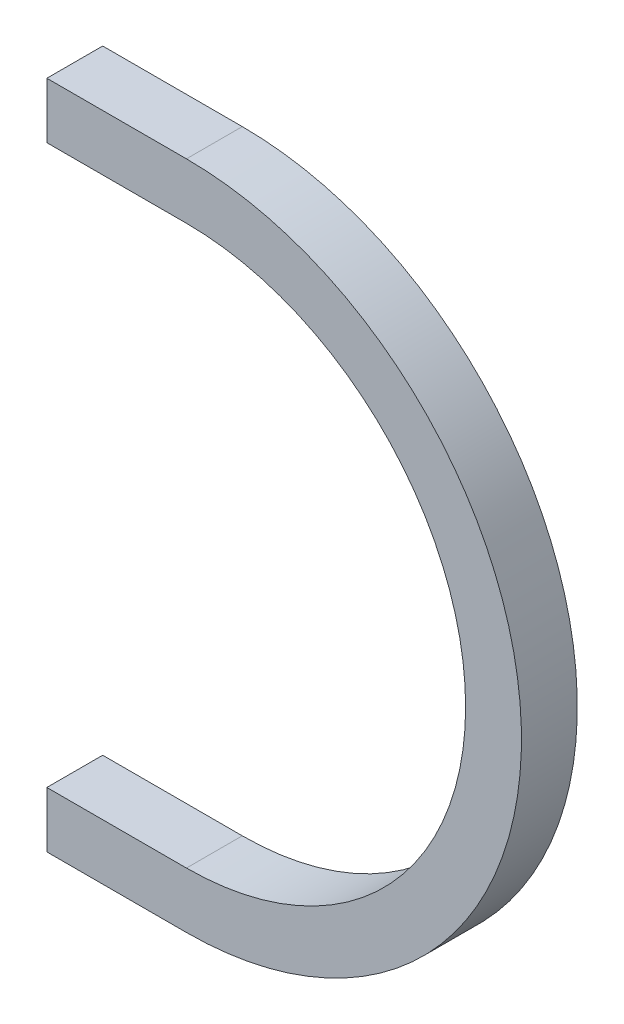
ISO-10303-21;
HEADER;
FILE_DESCRIPTION(('STEP AP214'),'2;1');
FILE_NAME('part.step','',(''),(''),'','','');
FILE_SCHEMA(('AUTOMOTIVE_DESIGN { 1 0 10303 214 1 1 1 1 }'));
ENDSEC;
DATA;
#1=APPLICATION_CONTEXT('core data for automotive mechanical design processes');
#2=APPLICATION_PROTOCOL_DEFINITION('international standard','automotive_design',2000,#1);
#3=PRODUCT_CONTEXT('',#1,'mechanical');
#4=PRODUCT('Part','Part','',(#3));
#5=PRODUCT_RELATED_PRODUCT_CATEGORY('part','',(#4));
#6=PRODUCT_DEFINITION_FORMATION('','',#4);
#7=PRODUCT_DEFINITION_CONTEXT('part definition',#1,'design');
#8=PRODUCT_DEFINITION('design','',#6,#7);
#9=PRODUCT_DEFINITION_SHAPE('','',#8);
#10=(LENGTH_UNIT() NAMED_UNIT(*) SI_UNIT(.MILLI.,.METRE.));
#11=(NAMED_UNIT(*) PLANE_ANGLE_UNIT() SI_UNIT($,.RADIAN.));
#12=(NAMED_UNIT(*) SI_UNIT($,.STERADIAN.) SOLID_ANGLE_UNIT());
#13=UNCERTAINTY_MEASURE_WITH_UNIT(LENGTH_MEASURE(1.E-05),#10,'distance_accuracy_value','');
#14=(GEOMETRIC_REPRESENTATION_CONTEXT(3) GLOBAL_UNCERTAINTY_ASSIGNED_CONTEXT((#13)) GLOBAL_UNIT_ASSIGNED_CONTEXT((#10,
#11,#12)) REPRESENTATION_CONTEXT('',''));
#15=CARTESIAN_POINT('',(0.,0.,0.));
#16=DIRECTION('',(0.,0.,1.));
#17=DIRECTION('',(1.,0.,0.));
#18=AXIS2_PLACEMENT_3D('',#15,#16,#17);
#19=CARTESIAN_POINT('',(0.,0.,200.));
#20=DIRECTION('',(0.,-1.,0.));
#21=DIRECTION('',(0.,0.,-1.));
#22=AXIS2_PLACEMENT_3D('',#19,#20,#21);
#23=PLANE('',#22);
#24=DIRECTION('',(-1.,0.,0.));
#25=VECTOR('',#24,1.);
#26=CARTESIAN_POINT('',(0.,0.,0.));
#27=LINE('',#26,#25);
#28=CARTESIAN_POINT('',(500.,0.,0.));
#29=VERTEX_POINT('',#28);
#30=CARTESIAN_POINT('',(0.,0.,0.));
#31=VERTEX_POINT('',#30);
#32=EDGE_CURVE('E140',#29,#31,#27,.T.);
#33=ORIENTED_EDGE('',*,*,#32,.T.);
#34=DIRECTION('',(0.,0.,-1.));
#35=VECTOR('',#34,1.);
#36=CARTESIAN_POINT('',(0.,0.,200.));
#37=LINE('',#36,#35);
#38=CARTESIAN_POINT('',(0.,0.,200.));
#39=VERTEX_POINT('',#38);
#40=EDGE_CURVE('E11',#39,#31,#37,.T.);
#41=ORIENTED_EDGE('',*,*,#40,.F.);
#42=DIRECTION('',(-1.,0.,0.));
#43=VECTOR('',#42,1.);
#44=CARTESIAN_POINT('',(0.,0.,200.));
#45=LINE('',#44,#43);
#46=CARTESIAN_POINT('',(500.,0.,200.));
#47=VERTEX_POINT('',#46);
#48=EDGE_CURVE('E162',#47,#39,#45,.T.);
#49=ORIENTED_EDGE('',*,*,#48,.F.);
#50=DIRECTION('',(0.,0.,-1.));
#51=VECTOR('',#50,1.);
#52=CARTESIAN_POINT('',(500.,0.,200.));
#53=LINE('',#52,#51);
#54=EDGE_CURVE('E136',#47,#29,#53,.T.);
#55=ORIENTED_EDGE('',*,*,#54,.T.);
#56=EDGE_LOOP('',(#33,#41,#49,#55));
#57=FACE_BOUND('',#56,.T.);
#58=ADVANCED_FACE('F39',(#57),#23,.F.);
#59=CARTESIAN_POINT('',(0.,0.,200.));
#60=DIRECTION('',(1.,0.,0.));
#61=DIRECTION('',(0.,0.,-1.));
#62=AXIS2_PLACEMENT_3D('',#59,#60,#61);
#63=PLANE('',#62);
#64=DIRECTION('',(0.,-1.,0.));
#65=VECTOR('',#64,1.);
#66=CARTESIAN_POINT('',(0.,0.,0.));
#67=LINE('',#66,#65);
#68=CARTESIAN_POINT('',(0.,-200.,0.));
#69=VERTEX_POINT('',#68);
#70=EDGE_CURVE('E144',#31,#69,#67,.T.);
#71=ORIENTED_EDGE('',*,*,#70,.T.);
#72=DIRECTION('',(0.,0.,-1.));
#73=VECTOR('',#72,1.);
#74=CARTESIAN_POINT('',(0.,-200.,200.));
#75=LINE('',#74,#73);
#76=CARTESIAN_POINT('',(0.,-200.,200.));
#77=VERTEX_POINT('',#76);
#78=EDGE_CURVE('E48',#77,#69,#75,.T.);
#79=ORIENTED_EDGE('',*,*,#78,.F.);
#80=DIRECTION('',(0.,-1.,0.));
#81=VECTOR('',#80,1.);
#82=CARTESIAN_POINT('',(0.,0.,200.));
#83=LINE('',#82,#81);
#84=EDGE_CURVE('E99',#39,#77,#83,.T.);
#85=ORIENTED_EDGE('',*,*,#84,.F.);
#86=ORIENTED_EDGE('',*,*,#40,.T.);
#87=EDGE_LOOP('',(#71,#79,#85,#86));
#88=FACE_BOUND('',#87,.T.);
#89=ADVANCED_FACE('F208',(#88),#63,.F.);
#90=CARTESIAN_POINT('',(0.,-200.,200.));
#91=DIRECTION('',(0.,1.,0.));
#92=DIRECTION('',(0.,0.,1.));
#93=AXIS2_PLACEMENT_3D('',#90,#91,#92);
#94=PLANE('',#93);
#95=DIRECTION('',(1.,0.,0.));
#96=VECTOR('',#95,1.);
#97=CARTESIAN_POINT('',(0.,-200.,0.));
#98=LINE('',#97,#96);
#99=CARTESIAN_POINT('',(500.,-200.,0.));
#100=VERTEX_POINT('',#99);
#101=EDGE_CURVE('E147',#69,#100,#98,.T.);
#102=ORIENTED_EDGE('',*,*,#101,.T.);
#103=DIRECTION('',(0.,0.,-1.));
#104=VECTOR('',#103,1.);
#105=CARTESIAN_POINT('',(500.,-200.,200.));
#106=LINE('',#105,#104);
#107=CARTESIAN_POINT('',(500.,-200.,200.));
#108=VERTEX_POINT('',#107);
#109=EDGE_CURVE('E173',#108,#100,#106,.T.);
#110=ORIENTED_EDGE('',*,*,#109,.F.);
#111=DIRECTION('',(1.,0.,0.));
#112=VECTOR('',#111,1.);
#113=CARTESIAN_POINT('',(0.,-200.,200.));
#114=LINE('',#113,#112);
#115=EDGE_CURVE('E183',#77,#108,#114,.T.);
#116=ORIENTED_EDGE('',*,*,#115,.F.);
#117=ORIENTED_EDGE('',*,*,#78,.T.);
#118=EDGE_LOOP('',(#102,#110,#116,#117));
#119=FACE_BOUND('',#118,.T.);
#120=ADVANCED_FACE('F181',(#119),#94,.F.);
#121=CARTESIAN_POINT('',(500.,-1200.,200.));
#122=DIRECTION('',(0.,0.,-1.));
#123=DIRECTION('',(-1.,0.,0.));
#124=AXIS2_PLACEMENT_3D('',#121,#122,#123);
#125=CYLINDRICAL_SURFACE('',#124,1000.);
#126=CARTESIAN_POINT('',(500.,-1200.,0.));
#127=DIRECTION('',(0.,0.,-1.));
#128=DIRECTION('',(1.,0.,0.));
#129=AXIS2_PLACEMENT_3D('',#126,#127,#128);
#130=CIRCLE('',#129,1000.);
#131=CARTESIAN_POINT('',(500.,-2200.,0.));
#132=VERTEX_POINT('',#131);
#133=EDGE_CURVE('E150',#100,#132,#130,.T.);
#134=ORIENTED_EDGE('',*,*,#133,.T.);
#135=DIRECTION('',(0.,0.,-1.));
#136=VECTOR('',#135,1.);
#137=CARTESIAN_POINT('',(500.,-2200.,200.));
#138=LINE('',#137,#136);
#139=CARTESIAN_POINT('',(500.,-2200.,200.));
#140=VERTEX_POINT('',#139);
#141=EDGE_CURVE('E169',#140,#132,#138,.T.);
#142=ORIENTED_EDGE('',*,*,#141,.F.);
#143=CARTESIAN_POINT('',(500.,-1200.,200.));
#144=DIRECTION('',(0.,0.,-1.));
#145=DIRECTION('',(1.,0.,0.));
#146=AXIS2_PLACEMENT_3D('',#143,#144,#145);
#147=CIRCLE('',#146,1000.);
#148=EDGE_CURVE('E196',#108,#140,#147,.T.);
#149=ORIENTED_EDGE('',*,*,#148,.F.);
#150=ORIENTED_EDGE('',*,*,#109,.T.);
#151=EDGE_LOOP('',(#134,#142,#149,#150));
#152=FACE_BOUND('',#151,.T.);
#153=ADVANCED_FACE('F191',(#152),#125,.F.);
#154=CARTESIAN_POINT('',(500.,-2200.,200.));
#155=DIRECTION('',(0.,-1.,0.));
#156=DIRECTION('',(0.,0.,-1.));
#157=AXIS2_PLACEMENT_3D('',#154,#155,#156);
#158=PLANE('',#157);
#159=DIRECTION('',(-1.,0.,0.));
#160=VECTOR('',#159,1.);
#161=CARTESIAN_POINT('',(500.,-2200.,0.));
#162=LINE('',#161,#160);
#163=CARTESIAN_POINT('',(0.,-2200.,0.));
#164=VERTEX_POINT('',#163);
#165=EDGE_CURVE('E153',#132,#164,#162,.T.);
#166=ORIENTED_EDGE('',*,*,#165,.T.);
#167=DIRECTION('',(0.,0.,-1.));
#168=VECTOR('',#167,1.);
#169=CARTESIAN_POINT('',(0.,-2200.,200.));
#170=LINE('',#169,#168);
#171=CARTESIAN_POINT('',(0.,-2200.,200.));
#172=VERTEX_POINT('',#171);
#173=EDGE_CURVE('E129',#172,#164,#170,.T.);
#174=ORIENTED_EDGE('',*,*,#173,.F.);
#175=DIRECTION('',(-1.,0.,0.));
#176=VECTOR('',#175,1.);
#177=CARTESIAN_POINT('',(500.,-2200.,200.));
#178=LINE('',#177,#176);
#179=EDGE_CURVE('E118',#140,#172,#178,.T.);
#180=ORIENTED_EDGE('',*,*,#179,.F.);
#181=ORIENTED_EDGE('',*,*,#141,.T.);
#182=EDGE_LOOP('',(#166,#174,#180,#181));
#183=FACE_BOUND('',#182,.T.);
#184=ADVANCED_FACE('F194',(#183),#158,.F.);
#185=CARTESIAN_POINT('',(0.,-2200.,200.));
#186=DIRECTION('',(1.,0.,0.));
#187=DIRECTION('',(0.,1.,0.));
#188=AXIS2_PLACEMENT_3D('',#185,#186,#187);
#189=PLANE('',#188);
#190=DIRECTION('',(0.,-1.,0.));
#191=VECTOR('',#190,1.);
#192=CARTESIAN_POINT('',(0.,-2200.,0.));
#193=LINE('',#192,#191);
#194=CARTESIAN_POINT('',(0.,-2400.,0.));
#195=VERTEX_POINT('',#194);
#196=EDGE_CURVE('E127',#164,#195,#193,.T.);
#197=ORIENTED_EDGE('',*,*,#196,.T.);
#198=DIRECTION('',(0.,0.,-1.));
#199=VECTOR('',#198,1.);
#200=CARTESIAN_POINT('',(0.,-2400.,200.));
#201=LINE('',#200,#199);
#202=CARTESIAN_POINT('',(0.,-2400.,200.));
#203=VERTEX_POINT('',#202);
#204=EDGE_CURVE('E124',#203,#195,#201,.T.);
#205=ORIENTED_EDGE('',*,*,#204,.F.);
#206=DIRECTION('',(0.,-1.,0.));
#207=VECTOR('',#206,1.);
#208=CARTESIAN_POINT('',(0.,-2200.,200.));
#209=LINE('',#208,#207);
#210=EDGE_CURVE('E112',#172,#203,#209,.T.);
#211=ORIENTED_EDGE('',*,*,#210,.F.);
#212=ORIENTED_EDGE('',*,*,#173,.T.);
#213=EDGE_LOOP('',(#197,#205,#211,#212));
#214=FACE_BOUND('',#213,.T.);
#215=ADVANCED_FACE('F125',(#214),#189,.F.);
#216=CARTESIAN_POINT('',(0.,-2400.,200.));
#217=DIRECTION('',(0.,1.,0.));
#218=DIRECTION('',(0.,0.,1.));
#219=AXIS2_PLACEMENT_3D('',#216,#217,#218);
#220=PLANE('',#219);
#221=DIRECTION('',(1.,0.,0.));
#222=VECTOR('',#221,1.);
#223=CARTESIAN_POINT('',(0.,-2400.,0.));
#224=LINE('',#223,#222);
#225=CARTESIAN_POINT('',(500.000000000011,-2400.,0.));
#226=VERTEX_POINT('',#225);
#227=EDGE_CURVE('E85',#195,#226,#224,.T.);
#228=ORIENTED_EDGE('',*,*,#227,.T.);
#229=DIRECTION('',(0.,0.,-1.));
#230=VECTOR('',#229,1.);
#231=CARTESIAN_POINT('',(500.000000000011,-2400.,200.));
#232=LINE('',#231,#230);
#233=CARTESIAN_POINT('',(500.000000000011,-2400.,200.));
#234=VERTEX_POINT('',#233);
#235=EDGE_CURVE('E130',#234,#226,#232,.T.);
#236=ORIENTED_EDGE('',*,*,#235,.F.);
#237=DIRECTION('',(1.,0.,0.));
#238=VECTOR('',#237,1.);
#239=CARTESIAN_POINT('',(0.,-2400.,200.));
#240=LINE('',#239,#238);
#241=EDGE_CURVE('E116',#203,#234,#240,.T.);
#242=ORIENTED_EDGE('',*,*,#241,.F.);
#243=ORIENTED_EDGE('',*,*,#204,.T.);
#244=EDGE_LOOP('',(#228,#236,#242,#243));
#245=FACE_BOUND('',#244,.T.);
#246=ADVANCED_FACE('F132',(#245),#220,.F.);
#247=CARTESIAN_POINT('',(500.000000000005,-1200.,200.));
#248=DIRECTION('',(0.,0.,-1.));
#249=DIRECTION('',(-1.,0.,0.));
#250=AXIS2_PLACEMENT_3D('',#247,#248,#249);
#251=CYLINDRICAL_SURFACE('',#250,1200.);
#252=CARTESIAN_POINT('',(500.000000000005,-1200.,0.));
#253=DIRECTION('',(0.,0.,1.));
#254=DIRECTION('',(-1.,0.,0.));
#255=AXIS2_PLACEMENT_3D('',#252,#253,#254);
#256=CIRCLE('',#255,1200.);
#257=EDGE_CURVE('E91',#226,#29,#256,.T.);
#258=ORIENTED_EDGE('',*,*,#257,.T.);
#259=ORIENTED_EDGE('',*,*,#54,.F.);
#260=CARTESIAN_POINT('',(500.000000000005,-1200.,200.));
#261=DIRECTION('',(0.,0.,1.));
#262=DIRECTION('',(-1.,0.,0.));
#263=AXIS2_PLACEMENT_3D('',#260,#261,#262);
#264=CIRCLE('',#263,1200.);
#265=EDGE_CURVE('E56',#234,#47,#264,.T.);
#266=ORIENTED_EDGE('',*,*,#265,.F.);
#267=ORIENTED_EDGE('',*,*,#235,.T.);
#268=EDGE_LOOP('',(#258,#259,#266,#267));
#269=FACE_BOUND('',#268,.T.);
#270=ADVANCED_FACE('F224',(#269),#251,.T.);
#271=CARTESIAN_POINT('',(500.000000000005,-1200.,200.));
#272=DIRECTION('',(0.,0.,-1.));
#273=DIRECTION('',(-1.,0.,0.));
#274=AXIS2_PLACEMENT_3D('',#271,#272,#273);
#275=PLANE('',#274);
#276=ORIENTED_EDGE('',*,*,#48,.T.);
#277=ORIENTED_EDGE('',*,*,#84,.T.);
#278=ORIENTED_EDGE('',*,*,#115,.T.);
#279=ORIENTED_EDGE('',*,*,#148,.T.);
#280=ORIENTED_EDGE('',*,*,#179,.T.);
#281=ORIENTED_EDGE('',*,*,#210,.T.);
#282=ORIENTED_EDGE('',*,*,#241,.T.);
#283=ORIENTED_EDGE('',*,*,#265,.T.);
#284=EDGE_LOOP('',(#276,#277,#278,#279,#280,#281,#282,#283));
#285=FACE_BOUND('',#284,.T.);
#286=ADVANCED_FACE('F114',(#285),#275,.F.);
#287=CARTESIAN_POINT('',(500.000000000005,-1200.,0.));
#288=DIRECTION('',(0.,0.,-1.));
#289=DIRECTION('',(-1.,0.,0.));
#290=AXIS2_PLACEMENT_3D('',#287,#288,#289);
#291=PLANE('',#290);
#292=ORIENTED_EDGE('',*,*,#32,.F.);
#293=ORIENTED_EDGE('',*,*,#257,.F.);
#294=ORIENTED_EDGE('',*,*,#227,.F.);
#295=ORIENTED_EDGE('',*,*,#196,.F.);
#296=ORIENTED_EDGE('',*,*,#165,.F.);
#297=ORIENTED_EDGE('',*,*,#133,.F.);
#298=ORIENTED_EDGE('',*,*,#101,.F.);
#299=ORIENTED_EDGE('',*,*,#70,.F.);
#300=EDGE_LOOP('',(#292,#293,#294,#295,#296,#297,#298,#299));
#301=FACE_BOUND('',#300,.T.);
#302=ADVANCED_FACE('F187',(#301),#291,.T.);
#303=CLOSED_SHELL('',(#58,#89,#120,#153,#184,#215,#246,#270,#286,#302));
#304=MANIFOLD_SOLID_BREP('B2',#303);
#305=ADVANCED_BREP_SHAPE_REPRESENTATION('',(#18,#304),#14);
#306=SHAPE_DEFINITION_REPRESENTATION(#9,#305);
ENDSEC;
END-ISO-10303-21;
